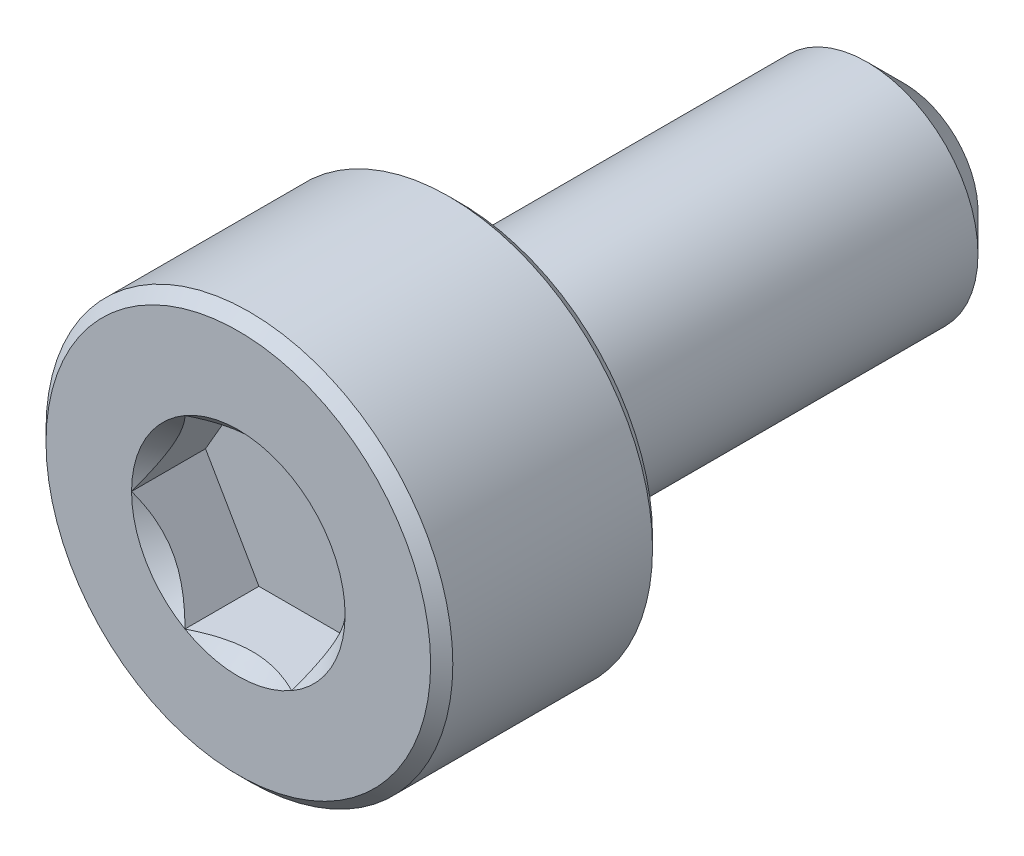
ISO-10303-21;
HEADER;
FILE_DESCRIPTION(('STEP AP214'),'2;1');
FILE_NAME('part.step','',(''),(''),'','','');
FILE_SCHEMA(('AUTOMOTIVE_DESIGN { 1 0 10303 214 1 1 1 1 }'));
ENDSEC;
DATA;
#1=APPLICATION_CONTEXT('core data for automotive mechanical design processes');
#2=APPLICATION_PROTOCOL_DEFINITION('international standard','automotive_design',2000,#1);
#3=PRODUCT_CONTEXT('',#1,'mechanical');
#4=PRODUCT('Part','Part','',(#3));
#5=PRODUCT_RELATED_PRODUCT_CATEGORY('part','',(#4));
#6=PRODUCT_DEFINITION_FORMATION('','',#4);
#7=PRODUCT_DEFINITION_CONTEXT('part definition',#1,'design');
#8=PRODUCT_DEFINITION('design','',#6,#7);
#9=PRODUCT_DEFINITION_SHAPE('','',#8);
#10=(LENGTH_UNIT() NAMED_UNIT(*) SI_UNIT(.MILLI.,.METRE.));
#11=(NAMED_UNIT(*) PLANE_ANGLE_UNIT() SI_UNIT($,.RADIAN.));
#12=(NAMED_UNIT(*) SI_UNIT($,.STERADIAN.) SOLID_ANGLE_UNIT());
#13=UNCERTAINTY_MEASURE_WITH_UNIT(LENGTH_MEASURE(1.E-05),#10,'distance_accuracy_value','');
#14=(GEOMETRIC_REPRESENTATION_CONTEXT(3) GLOBAL_UNCERTAINTY_ASSIGNED_CONTEXT((#13)) GLOBAL_UNIT_ASSIGNED_CONTEXT((#10,
#11,#12)) REPRESENTATION_CONTEXT('',''));
#15=CARTESIAN_POINT('',(0.,0.,0.));
#16=DIRECTION('',(0.,0.,1.));
#17=DIRECTION('',(1.,0.,0.));
#18=AXIS2_PLACEMENT_3D('',#15,#16,#17);
#19=CARTESIAN_POINT('',(0.,2.6,4.5));
#20=DIRECTION('',(0.,0.,1.));
#21=DIRECTION('',(1.,0.,0.));
#22=AXIS2_PLACEMENT_3D('',#19,#20,#21);
#23=PLANE('',#22);
#24=CARTESIAN_POINT('',(0.,0.,4.5));
#25=DIRECTION('',(0.,0.,1.));
#26=DIRECTION('',(1.,0.,0.));
#27=AXIS2_PLACEMENT_3D('',#24,#25,#26);
#28=CIRCLE('',#27,1.44337567297406);
#29=CARTESIAN_POINT('',(1.44337567297406,0.,4.5));
#30=VERTEX_POINT('',#29);
#31=CARTESIAN_POINT('',(0.721687836487031,1.25,4.5));
#32=VERTEX_POINT('',#31);
#33=EDGE_CURVE('E94',#30,#32,#28,.T.);
#34=ORIENTED_EDGE('',*,*,#33,.F.);
#35=CARTESIAN_POINT('',(0.721687836487031,-1.25,4.5));
#36=VERTEX_POINT('',#35);
#37=EDGE_CURVE('E54',#36,#30,#28,.T.);
#38=ORIENTED_EDGE('',*,*,#37,.F.);
#39=CARTESIAN_POINT('',(-0.721687836487033,-1.25,4.5));
#40=VERTEX_POINT('',#39);
#41=EDGE_CURVE('E297',#40,#36,#28,.T.);
#42=ORIENTED_EDGE('',*,*,#41,.F.);
#43=CARTESIAN_POINT('',(-1.44337567297406,0.,4.5));
#44=VERTEX_POINT('',#43);
#45=EDGE_CURVE('E61',#44,#40,#28,.T.);
#46=ORIENTED_EDGE('',*,*,#45,.F.);
#47=CARTESIAN_POINT('',(-0.721687836487031,1.25,4.5));
#48=VERTEX_POINT('',#47);
#49=EDGE_CURVE('E129',#48,#44,#28,.T.);
#50=ORIENTED_EDGE('',*,*,#49,.F.);
#51=EDGE_CURVE('E103',#32,#48,#28,.T.);
#52=ORIENTED_EDGE('',*,*,#51,.F.);
#53=EDGE_LOOP('',(#34,#38,#42,#46,#50,#52));
#54=FACE_BOUND('',#53,.T.);
#55=CARTESIAN_POINT('',(0.,0.,4.5));
#56=DIRECTION('',(0.,0.,-1.));
#57=DIRECTION('',(-1.,0.,0.));
#58=AXIS2_PLACEMENT_3D('',#55,#56,#57);
#59=CIRCLE('',#58,2.6);
#60=CARTESIAN_POINT('',(-2.6,0.,4.5));
#61=VERTEX_POINT('',#60);
#62=EDGE_CURVE('E48',#61,#61,#59,.T.);
#63=ORIENTED_EDGE('',*,*,#62,.F.);
#64=EDGE_LOOP('',(#63));
#65=FACE_BOUND('',#64,.T.);
#66=ADVANCED_FACE('F35',(#54,#65),#23,.T.);
#67=CARTESIAN_POINT('',(0.,0.,4.35));
#68=DIRECTION('',(0.,0.,-1.));
#69=DIRECTION('',(-1.,0.,0.));
#70=AXIS2_PLACEMENT_3D('',#67,#68,#69);
#71=CONICAL_SURFACE('',#70,2.75,0.785398163397447);
#72=ORIENTED_EDGE('',*,*,#62,.T.);
#73=EDGE_LOOP('',(#72));
#74=FACE_BOUND('',#73,.T.);
#75=CARTESIAN_POINT('',(0.,0.,4.35));
#76=DIRECTION('',(0.,0.,-1.));
#77=DIRECTION('',(-1.,0.,0.));
#78=AXIS2_PLACEMENT_3D('',#75,#76,#77);
#79=CIRCLE('',#78,2.75);
#80=CARTESIAN_POINT('',(-2.75,0.,4.35));
#81=VERTEX_POINT('',#80);
#82=EDGE_CURVE('E272',#81,#81,#79,.T.);
#83=ORIENTED_EDGE('',*,*,#82,.F.);
#84=EDGE_LOOP('',(#83));
#85=FACE_BOUND('',#84,.T.);
#86=ADVANCED_FACE('F193',(#74,#85),#71,.T.);
#87=CARTESIAN_POINT('',(0.,0.,-4.5));
#88=DIRECTION('',(0.,0.,-1.));
#89=DIRECTION('',(-1.,0.,0.));
#90=AXIS2_PLACEMENT_3D('',#87,#88,#89);
#91=CYLINDRICAL_SURFACE('',#90,2.75);
#92=ORIENTED_EDGE('',*,*,#82,.T.);
#93=EDGE_LOOP('',(#92));
#94=FACE_BOUND('',#93,.T.);
#95=CARTESIAN_POINT('',(0.,0.,1.65));
#96=DIRECTION('',(0.,0.,-1.));
#97=DIRECTION('',(-1.,0.,0.));
#98=AXIS2_PLACEMENT_3D('',#95,#96,#97);
#99=CIRCLE('',#98,2.75);
#100=CARTESIAN_POINT('',(-2.75,0.,1.65));
#101=VERTEX_POINT('',#100);
#102=EDGE_CURVE('E269',#101,#101,#99,.T.);
#103=ORIENTED_EDGE('',*,*,#102,.F.);
#104=EDGE_LOOP('',(#103));
#105=FACE_BOUND('',#104,.T.);
#106=ADVANCED_FACE('F197',(#94,#105),#91,.T.);
#107=CARTESIAN_POINT('',(0.,0.,1.5));
#108=DIRECTION('',(0.,0.,1.));
#109=DIRECTION('',(1.,0.,0.));
#110=AXIS2_PLACEMENT_3D('',#107,#108,#109);
#111=CONICAL_SURFACE('',#110,2.6,0.785398163397447);
#112=ORIENTED_EDGE('',*,*,#102,.T.);
#113=EDGE_LOOP('',(#112));
#114=FACE_BOUND('',#113,.T.);
#115=CARTESIAN_POINT('',(0.,0.,1.5));
#116=DIRECTION('',(0.,0.,-1.));
#117=DIRECTION('',(-1.,0.,0.));
#118=AXIS2_PLACEMENT_3D('',#115,#116,#117);
#119=CIRCLE('',#118,2.6);
#120=CARTESIAN_POINT('',(-2.6,0.,1.5));
#121=VERTEX_POINT('',#120);
#122=EDGE_CURVE('E266',#121,#121,#119,.T.);
#123=ORIENTED_EDGE('',*,*,#122,.F.);
#124=EDGE_LOOP('',(#123));
#125=FACE_BOUND('',#124,.T.);
#126=ADVANCED_FACE('F202',(#114,#125),#111,.T.);
#127=CARTESIAN_POINT('',(0.,2.6,1.5));
#128=DIRECTION('',(0.,0.,-1.));
#129=DIRECTION('',(-1.,0.,0.));
#130=AXIS2_PLACEMENT_3D('',#127,#128,#129);
#131=PLANE('',#130);
#132=ORIENTED_EDGE('',*,*,#122,.T.);
#133=EDGE_LOOP('',(#132));
#134=FACE_BOUND('',#133,.T.);
#135=CARTESIAN_POINT('',(0.,0.,1.5));
#136=DIRECTION('',(0.,0.,-1.));
#137=DIRECTION('',(-1.,0.,0.));
#138=AXIS2_PLACEMENT_3D('',#135,#136,#137);
#139=CIRCLE('',#138,1.5);
#140=CARTESIAN_POINT('',(-1.5,0.,1.5));
#141=VERTEX_POINT('',#140);
#142=EDGE_CURVE('E263',#141,#141,#139,.T.);
#143=ORIENTED_EDGE('',*,*,#142,.F.);
#144=EDGE_LOOP('',(#143));
#145=FACE_BOUND('',#144,.T.);
#146=ADVANCED_FACE('F210',(#134,#145),#131,.T.);
#147=CARTESIAN_POINT('',(0.,0.,-4.5));
#148=DIRECTION('',(0.,0.,-1.));
#149=DIRECTION('',(-1.,0.,0.));
#150=AXIS2_PLACEMENT_3D('',#147,#148,#149);
#151=CYLINDRICAL_SURFACE('',#150,1.5);
#152=ORIENTED_EDGE('',*,*,#142,.T.);
#153=EDGE_LOOP('',(#152));
#154=FACE_BOUND('',#153,.T.);
#155=CARTESIAN_POINT('',(0.,0.,-3.99999999999999));
#156=DIRECTION('',(0.,0.,-1.));
#157=DIRECTION('',(-1.,0.,0.));
#158=AXIS2_PLACEMENT_3D('',#155,#156,#157);
#159=CIRCLE('',#158,1.5);
#160=CARTESIAN_POINT('',(-1.5,0.,-3.99999999999999));
#161=VERTEX_POINT('',#160);
#162=EDGE_CURVE('E260',#161,#161,#159,.T.);
#163=ORIENTED_EDGE('',*,*,#162,.F.);
#164=EDGE_LOOP('',(#163));
#165=FACE_BOUND('',#164,.T.);
#166=ADVANCED_FACE('F214',(#154,#165),#151,.T.);
#167=CARTESIAN_POINT('',(0.,0.,-4.5));
#168=DIRECTION('',(0.,0.,1.));
#169=DIRECTION('',(1.,0.,0.));
#170=AXIS2_PLACEMENT_3D('',#167,#168,#169);
#171=CONICAL_SURFACE('',#170,1.,0.785398163397442);
#172=ORIENTED_EDGE('',*,*,#162,.T.);
#173=EDGE_LOOP('',(#172));
#174=FACE_BOUND('',#173,.T.);
#175=CARTESIAN_POINT('',(0.,0.,-4.5));
#176=DIRECTION('',(0.,0.,-1.));
#177=DIRECTION('',(-1.,0.,0.));
#178=AXIS2_PLACEMENT_3D('',#175,#176,#177);
#179=CIRCLE('',#178,1.);
#180=CARTESIAN_POINT('',(-1.,0.,-4.5));
#181=VERTEX_POINT('',#180);
#182=EDGE_CURVE('E242',#181,#181,#179,.T.);
#183=ORIENTED_EDGE('',*,*,#182,.F.);
#184=EDGE_LOOP('',(#183));
#185=FACE_BOUND('',#184,.T.);
#186=ADVANCED_FACE('F218',(#174,#185),#171,.T.);
#187=CARTESIAN_POINT('',(0.,1.,-4.5));
#188=DIRECTION('',(0.,0.,-1.));
#189=DIRECTION('',(-1.,0.,0.));
#190=AXIS2_PLACEMENT_3D('',#187,#188,#189);
#191=PLANE('',#190);
#192=ORIENTED_EDGE('',*,*,#182,.T.);
#193=EDGE_LOOP('',(#192));
#194=FACE_BOUND('',#193,.T.);
#195=ADVANCED_FACE('F222',(#194),#191,.T.);
#196=CARTESIAN_POINT('',(0.,0.,4.5));
#197=DIRECTION('',(0.,0.,1.));
#198=DIRECTION('',(1.,0.,0.));
#199=AXIS2_PLACEMENT_3D('',#196,#197,#198);
#200=CONICAL_SURFACE('',#199,1.44337567297406,0.78539816339745);
#201=ORIENTED_EDGE('',*,*,#51,.T.);
#202=CARTESIAN_POINT('',(-1.38510181874982,1.25,4.92237003539674));
#203=CARTESIAN_POINT('',(-1.3511198664462,1.25,4.89714624516244));
#204=CARTESIAN_POINT('',(-1.31694282655271,1.25,4.87218595606241));
#205=CARTESIAN_POINT('',(-1.24812142569207,1.25,4.82289946364711));
#206=CARTESIAN_POINT('',(-1.21347694388891,1.25,4.7985734292472));
#207=CARTESIAN_POINT('',(-1.10822083190006,1.25,4.72636172296323));
#208=CARTESIAN_POINT('',(-1.0368031370095,1.25,4.67963105585342));
#209=CARTESIAN_POINT('',(-0.887382773604422,1.25,4.58837288370571));
#210=CARTESIAN_POINT('',(-0.809230859559387,1.25,4.54408680019188));
#211=CARTESIAN_POINT('',(-0.649095969048193,1.25,4.46341771967474));
#212=CARTESIAN_POINT('',(-0.567127025311257,1.25,4.42700818355541));
#213=CARTESIAN_POINT('',(-0.443557329124525,1.25,4.38248253752399));
#214=CARTESIAN_POINT('',(-0.403672751095206,1.25,4.36961750878661));
#215=CARTESIAN_POINT('',(-0.322988211495524,1.25,4.34709732587494));
#216=CARTESIAN_POINT('',(-0.282188182544569,1.25,4.3374424088096));
#217=CARTESIAN_POINT('',(-0.200572984829334,1.25,4.32199119628927));
#218=CARTESIAN_POINT('',(-0.159769911270981,1.25,4.31613197729548));
#219=CARTESIAN_POINT('',(-0.0777868297167925,1.25,4.30837795442431));
#220=CARTESIAN_POINT('',(-0.0366068776776866,1.25,4.30648257131138));
#221=CARTESIAN_POINT('',(0.0444683003388069,1.25,4.30677812948321));
#222=CARTESIAN_POINT('',(0.0843640386448805,1.25,4.3088450344818));
#223=CARTESIAN_POINT('',(0.16379054813703,1.25,4.3166895703397));
#224=CARTESIAN_POINT('',(0.203321244417683,1.25,4.32246794634046));
#225=CARTESIAN_POINT('',(0.282393987539772,1.25,4.33752741705993));
#226=CARTESIAN_POINT('',(0.321924895820598,1.25,4.34686615718743));
#227=CARTESIAN_POINT('',(0.400129026379049,1.25,4.36856655366507));
#228=CARTESIAN_POINT('',(0.438802337754634,1.25,4.38092789436938));
#229=CARTESIAN_POINT('',(0.563172797994067,1.25,4.42526147510657));
#230=CARTESIAN_POINT('',(0.647028634884196,1.25,4.46238856151275));
#231=CARTESIAN_POINT('',(0.810774513742064,1.25,4.54485212171168));
#232=CARTESIAN_POINT('',(0.890648634134941,1.25,4.59021863514241));
#233=CARTESIAN_POINT('',(1.04325497380786,1.25,4.68372168049333));
#234=CARTESIAN_POINT('',(1.11614441754118,1.25,4.73160472363706));
#235=CARTESIAN_POINT('',(1.22353403061444,1.25,4.8055883961688));
#236=CARTESIAN_POINT('',(1.25886568278664,1.25,4.83050307518733));
#237=CARTESIAN_POINT('',(1.32904842602817,1.25,4.88098117870981));
#238=CARTESIAN_POINT('',(1.36389964521094,1.25,4.90654442489043));
#239=CARTESIAN_POINT('',(1.39855118522491,1.25,4.93237628762573));
#240=B_SPLINE_CURVE_WITH_KNOTS('',3,(#202,#203,#204,#205,#206,#207,#208,#209,#210,#211,#212,
#213,#214,#215,#216,#217,#218,#219,#220,#221,#222,#223,#224,#225,#226,#227,#228,#229,#230,#231,
#232,#233,#234,#235,#236,#237,#238,#239),.UNSPECIFIED.,.F.,.F.,(4,2,2,2,2,2,2,2,2,2,2,2,2,2,2,2,
2,2,4),(0.,0.126957685716233,0.253948844536467,0.509869207561396,0.779115442456376,
1.04743984385779,1.17305649104353,1.29868241461005,1.42216852508156,1.54563658925964,
1.66530259813563,1.78499263952808,1.90670905530249,2.0284127658315,2.30272027123448,
2.57804870180744,2.83955157020837,2.96924487037104,3.0989028897939),.UNSPECIFIED.);
#241=EDGE_CURVE('E12',#32,#48,#240,.F.);
#242=ORIENTED_EDGE('',*,*,#241,.F.);
#243=EDGE_LOOP('',(#201,#242));
#244=FACE_BOUND('',#243,.T.);
#245=ADVANCED_FACE('F107',(#244),#200,.F.);
#246=ORIENTED_EDGE('',*,*,#49,.T.);
#247=CARTESIAN_POINT('',(-0.721572366433194,1.2502,4.50011548390914));
#248=CARTESIAN_POINT('',(-0.746384090710444,1.20722483292841,4.47532166805511));
#249=CARTESIAN_POINT('',(-0.771610739653664,1.16353099525405,4.45198373441869));
#250=CARTESIAN_POINT('',(-0.823050873919154,1.07443406915806,4.40925200408454));
#251=CARTESIAN_POINT('',(-0.849269254648333,1.02902250164294,4.38988199236042));
#252=CARTESIAN_POINT('',(-0.902137405038635,0.937452179064741,4.35670048341348));
#253=CARTESIAN_POINT('',(-0.928773701756387,0.891316759824116,4.34280555905266));
#254=CARTESIAN_POINT('',(-0.982632884076012,0.798029919592409,4.32139728216064));
#255=CARTESIAN_POINT('',(-1.00985412292348,0.750881350863622,4.31386794156679));
#256=CARTESIAN_POINT('',(-1.05676666578643,0.66962644311275,4.3070744980507));
#257=CARTESIAN_POINT('',(-1.07639733689152,0.635625123372061,4.30606855910435));
#258=CARTESIAN_POINT('',(-1.11562418145499,0.567682235567525,4.30776141491132));
#259=CARTESIAN_POINT('',(-1.1352203463451,0.533740682344345,4.31046102721554));
#260=CARTESIAN_POINT('',(-1.1742235548576,0.466185143542503,4.31940893031638));
#261=CARTESIAN_POINT('',(-1.19363040521232,0.432571492713227,4.32566052589971));
#262=CARTESIAN_POINT('',(-1.23212011385119,0.365905361782189,4.3413756814139));
#263=CARTESIAN_POINT('',(-1.2512028293628,0.332853128969707,4.35084062008746));
#264=CARTESIAN_POINT('',(-1.30007715810653,0.248200308399738,4.37893139068759));
#265=CARTESIAN_POINT('',(-1.32956058931202,0.197133507570364,4.3996701574522));
#266=CARTESIAN_POINT('',(-1.38737318998519,0.0969991458867465,4.44638713467148));
#267=CARTESIAN_POINT('',(-1.41570576386268,0.0479256884217316,4.47234829594677));
#268=CARTESIAN_POINT('',(-1.4434911430279,-0.000199999999999488,4.50011548390914));
#269=B_SPLINE_CURVE_WITH_KNOTS('',3,(#247,#248,#249,#250,#251,#252,#253,#254,#255,#256,#257,
#258,#259,#260,#261,#262,#263,#264,#265,#266,#267,#268),.UNSPECIFIED.,.F.,.F.,(4,2,2,2,2,2,2,2,
2,2,4),(0.,0.166533409618303,0.334037607289761,0.498880396489697,0.663307919240272,
0.780963963458824,0.89864597014845,1.01643764860773,1.13427993171549,1.32148652032141,
1.50809158792573),.UNSPECIFIED.);
#270=EDGE_CURVE('E102',#48,#44,#269,.T.);
#271=ORIENTED_EDGE('',*,*,#270,.F.);
#272=EDGE_LOOP('',(#246,#271));
#273=FACE_BOUND('',#272,.T.);
#274=ADVANCED_FACE('F305',(#273),#200,.F.);
#275=ORIENTED_EDGE('',*,*,#45,.T.);
#276=CARTESIAN_POINT('',(-1.4434911430279,0.000200000000000513,4.50011548390914));
#277=CARTESIAN_POINT('',(-1.41867941875065,-0.0427751670715862,4.47532166805511));
#278=CARTESIAN_POINT('',(-1.39345276980743,-0.0864690047459475,4.45198373441869));
#279=CARTESIAN_POINT('',(-1.34201263554194,-0.175565930841941,4.40925200408454));
#280=CARTESIAN_POINT('',(-1.31579425481276,-0.220977498357064,4.38988199236042));
#281=CARTESIAN_POINT('',(-1.26292610442246,-0.312547820935259,4.35670048341348));
#282=CARTESIAN_POINT('',(-1.23628980770471,-0.358683240175885,4.34280555905266));
#283=CARTESIAN_POINT('',(-1.18243062538508,-0.451970080407592,4.32139728216064));
#284=CARTESIAN_POINT('',(-1.15520938653761,-0.499118649136379,4.31386794156679));
#285=CARTESIAN_POINT('',(-1.10829684367467,-0.580373556887252,4.3070744980507));
#286=CARTESIAN_POINT('',(-1.08866617256958,-0.614374876627941,4.30606855910435));
#287=CARTESIAN_POINT('',(-1.04943932800611,-0.682317764432477,4.30776141491132));
#288=CARTESIAN_POINT('',(-1.02984316311599,-0.716259317655657,4.31046102721554));
#289=CARTESIAN_POINT('',(-0.990839954603499,-0.783814856457499,4.31940893031638));
#290=CARTESIAN_POINT('',(-0.971433104248771,-0.817428507286775,4.32566052589971));
#291=CARTESIAN_POINT('',(-0.932943395609905,-0.884094638217813,4.34137568141391));
#292=CARTESIAN_POINT('',(-0.913860680098301,-0.917146871030295,4.35084062008746));
#293=CARTESIAN_POINT('',(-0.864986351354568,-1.00179969160026,4.37893139068759));
#294=CARTESIAN_POINT('',(-0.835502920149076,-1.05286649242964,4.3996701574522));
#295=CARTESIAN_POINT('',(-0.777690319475909,-1.15300085411325,4.44638713467148));
#296=CARTESIAN_POINT('',(-0.749357745598417,-1.20207431157827,4.47234829594677));
#297=CARTESIAN_POINT('',(-0.721572366433195,-1.2502,4.50011548390914));
#298=B_SPLINE_CURVE_WITH_KNOTS('',3,(#276,#277,#278,#279,#280,#281,#282,#283,#284,#285,#286,
#287,#288,#289,#290,#291,#292,#293,#294,#295,#296,#297),.UNSPECIFIED.,.F.,.F.,(4,2,2,2,2,2,2,2,
2,2,4),(0.,0.166533409618304,0.334037607289762,0.498880396489698,0.663307919240275,
0.780963963458827,0.898645970148453,1.01643764860773,1.1342799317155,1.32148652032141,
1.50809158792573),.UNSPECIFIED.);
#299=EDGE_CURVE('E138',#44,#40,#298,.T.);
#300=ORIENTED_EDGE('',*,*,#299,.F.);
#301=EDGE_LOOP('',(#275,#300));
#302=FACE_BOUND('',#301,.T.);
#303=ADVANCED_FACE('F300',(#302),#200,.F.);
#304=ORIENTED_EDGE('',*,*,#41,.T.);
#305=CARTESIAN_POINT('',(-1.38510181874983,-1.25,4.92237003539674));
#306=CARTESIAN_POINT('',(-1.3511198664462,-1.25,4.89714624516244));
#307=CARTESIAN_POINT('',(-1.31694282655271,-1.25,4.87218595606241));
#308=CARTESIAN_POINT('',(-1.24812142569207,-1.25,4.82289946364711));
#309=CARTESIAN_POINT('',(-1.21347694388891,-1.25,4.7985734292472));
#310=CARTESIAN_POINT('',(-1.10822083190006,-1.25,4.72636172296323));
#311=CARTESIAN_POINT('',(-1.0368031370095,-1.25,4.67963105585342));
#312=CARTESIAN_POINT('',(-0.887382773604422,-1.25,4.58837288370571));
#313=CARTESIAN_POINT('',(-0.809230859559387,-1.25,4.54408680019188));
#314=CARTESIAN_POINT('',(-0.649095969048193,-1.25,4.46341771967474));
#315=CARTESIAN_POINT('',(-0.567127025311257,-1.25,4.42700818355541));
#316=CARTESIAN_POINT('',(-0.443557329124525,-1.25,4.38248253752399));
#317=CARTESIAN_POINT('',(-0.403672751095206,-1.25,4.36961750878661));
#318=CARTESIAN_POINT('',(-0.322988211495524,-1.25,4.34709732587493));
#319=CARTESIAN_POINT('',(-0.28218818254457,-1.25,4.3374424088096));
#320=CARTESIAN_POINT('',(-0.200572984829335,-1.25,4.32199119628927));
#321=CARTESIAN_POINT('',(-0.159769911270982,-1.25,4.31613197729548));
#322=CARTESIAN_POINT('',(-0.077786829716793,-1.25,4.30837795442431));
#323=CARTESIAN_POINT('',(-0.0366068776776872,-1.25,4.30648257131138));
#324=CARTESIAN_POINT('',(0.0444683003388065,-1.25,4.30677812948321));
#325=CARTESIAN_POINT('',(0.0843640386448801,-1.25,4.3088450344818));
#326=CARTESIAN_POINT('',(0.16379054813703,-1.25,4.31668957033969));
#327=CARTESIAN_POINT('',(0.203321244417683,-1.25,4.32246794634046));
#328=CARTESIAN_POINT('',(0.282393987539771,-1.25,4.33752741705993));
#329=CARTESIAN_POINT('',(0.321924895820597,-1.25,4.34686615718743));
#330=CARTESIAN_POINT('',(0.400129026379048,-1.25,4.36856655366507));
#331=CARTESIAN_POINT('',(0.438802337754633,-1.25,4.38092789436938));
#332=CARTESIAN_POINT('',(0.563172797994066,-1.25,4.42526147510656));
#333=CARTESIAN_POINT('',(0.647028634884195,-1.25,4.46238856151275));
#334=CARTESIAN_POINT('',(0.810774513742062,-1.25,4.54485212171168));
#335=CARTESIAN_POINT('',(0.890648634134939,-1.25,4.5902186351424));
#336=CARTESIAN_POINT('',(1.04325497380785,-1.25,4.68372168049333));
#337=CARTESIAN_POINT('',(1.11614441754118,-1.25,4.73160472363706));
#338=CARTESIAN_POINT('',(1.22353403061444,-1.25,4.8055883961688));
#339=CARTESIAN_POINT('',(1.25886568278664,-1.25,4.83050307518733));
#340=CARTESIAN_POINT('',(1.32904842602817,-1.25,4.8809811787098));
#341=CARTESIAN_POINT('',(1.36389964521094,-1.25,4.90654442489043));
#342=CARTESIAN_POINT('',(1.3985511852249,-1.25,4.93237628762573));
#343=B_SPLINE_CURVE_WITH_KNOTS('',3,(#305,#306,#307,#308,#309,#310,#311,#312,#313,#314,#315,
#316,#317,#318,#319,#320,#321,#322,#323,#324,#325,#326,#327,#328,#329,#330,#331,#332,#333,#334,
#335,#336,#337,#338,#339,#340,#341,#342),.UNSPECIFIED.,.F.,.F.,(4,2,2,2,2,2,2,2,2,2,2,2,2,2,2,2,
2,2,4),(0.,0.126957685716233,0.253948844536467,0.509869207561397,0.779115442456378,
1.04743984385779,1.17305649104353,1.29868241461005,1.42216852508156,1.54563658925964,
1.66530259813563,1.78499263952808,1.90670905530249,2.0284127658315,2.30272027123448,
2.57804870180744,2.83955157020837,2.96924487037104,3.0989028897939),.UNSPECIFIED.);
#344=EDGE_CURVE('E158',#40,#36,#343,.T.);
#345=ORIENTED_EDGE('',*,*,#344,.F.);
#346=EDGE_LOOP('',(#304,#345));
#347=FACE_BOUND('',#346,.T.);
#348=ADVANCED_FACE('F298',(#347),#200,.F.);
#349=ORIENTED_EDGE('',*,*,#37,.T.);
#350=CARTESIAN_POINT('',(0.721572366433193,-1.2502,4.50011548390914));
#351=CARTESIAN_POINT('',(0.746384090710443,-1.20722483292841,4.4753216680551));
#352=CARTESIAN_POINT('',(0.771610739653663,-1.16353099525405,4.45198373441868));
#353=CARTESIAN_POINT('',(0.823050873919153,-1.07443406915806,4.40925200408454));
#354=CARTESIAN_POINT('',(0.849269254648332,-1.02902250164294,4.38988199236041));
#355=CARTESIAN_POINT('',(0.902137405038634,-0.93745217906474,4.35670048341348));
#356=CARTESIAN_POINT('',(0.928773701756385,-0.891316759824115,4.34280555905266));
#357=CARTESIAN_POINT('',(0.982632884076011,-0.798029919592408,4.32139728216064));
#358=CARTESIAN_POINT('',(1.00985412292348,-0.750881350863621,4.31386794156679));
#359=CARTESIAN_POINT('',(1.05676666578643,-0.669626443112749,4.3070744980507));
#360=CARTESIAN_POINT('',(1.07639733689152,-0.63562512337206,4.30606855910435));
#361=CARTESIAN_POINT('',(1.11562418145498,-0.567682235567524,4.30776141491132));
#362=CARTESIAN_POINT('',(1.1352203463451,-0.533740682344344,4.31046102721554));
#363=CARTESIAN_POINT('',(1.1742235548576,-0.466185143542502,4.31940893031638));
#364=CARTESIAN_POINT('',(1.19363040521232,-0.432571492713226,4.32566052589971));
#365=CARTESIAN_POINT('',(1.23212011385119,-0.365905361782188,4.3413756814139));
#366=CARTESIAN_POINT('',(1.25120282936279,-0.332853128969706,4.35084062008746));
#367=CARTESIAN_POINT('',(1.30007715810653,-0.248200308399737,4.37893139068759));
#368=CARTESIAN_POINT('',(1.32956058931202,-0.197133507570362,4.3996701574522));
#369=CARTESIAN_POINT('',(1.38737318998519,-0.096999145886745,4.44638713467148));
#370=CARTESIAN_POINT('',(1.41570576386268,-0.0479256884217301,4.47234829594677));
#371=CARTESIAN_POINT('',(1.4434911430279,0.00020000000000041,4.50011548390914));
#372=B_SPLINE_CURVE_WITH_KNOTS('',3,(#350,#351,#352,#353,#354,#355,#356,#357,#358,#359,#360,
#361,#362,#363,#364,#365,#366,#367,#368,#369,#370,#371),.UNSPECIFIED.,.F.,.F.,(4,2,2,2,2,2,2,2,
2,2,4),(0.,0.166533409618303,0.33403760728976,0.498880396489697,0.663307919240272,
0.780963963458824,0.89864597014845,1.01643764860773,1.13427993171549,1.32148652032141,
1.50809158792574),.UNSPECIFIED.);
#373=EDGE_CURVE('E119',#36,#30,#372,.T.);
#374=ORIENTED_EDGE('',*,*,#373,.F.);
#375=EDGE_LOOP('',(#349,#374));
#376=FACE_BOUND('',#375,.T.);
#377=ADVANCED_FACE('F151',(#376),#200,.F.);
#378=ORIENTED_EDGE('',*,*,#33,.T.);
#379=CARTESIAN_POINT('',(1.4434911430279,-0.000199999999999486,4.50011548390914));
#380=CARTESIAN_POINT('',(1.41867941875065,0.0427751670715871,4.4753216680551));
#381=CARTESIAN_POINT('',(1.39345276980743,0.0864690047459483,4.45198373441868));
#382=CARTESIAN_POINT('',(1.34201263554194,0.175565930841942,4.40925200408454));
#383=CARTESIAN_POINT('',(1.31579425481276,0.220977498357064,4.38988199236041));
#384=CARTESIAN_POINT('',(1.26292610442246,0.31254782093526,4.35670048341348));
#385=CARTESIAN_POINT('',(1.23628980770471,0.358683240175885,4.34280555905266));
#386=CARTESIAN_POINT('',(1.18243062538508,0.451970080407592,4.32139728216064));
#387=CARTESIAN_POINT('',(1.15520938653761,0.499118649136379,4.31386794156679));
#388=CARTESIAN_POINT('',(1.10829684367467,0.580373556887252,4.3070744980507));
#389=CARTESIAN_POINT('',(1.08866617256958,0.61437487662794,4.30606855910435));
#390=CARTESIAN_POINT('',(1.04943932800611,0.682317764432477,4.30776141491132));
#391=CARTESIAN_POINT('',(1.02984316311599,0.716259317655657,4.31046102721554));
#392=CARTESIAN_POINT('',(0.990839954603499,0.783814856457499,4.31940893031638));
#393=CARTESIAN_POINT('',(0.971433104248771,0.817428507286774,4.32566052589971));
#394=CARTESIAN_POINT('',(0.932943395609905,0.884094638217812,4.34137568141391));
#395=CARTESIAN_POINT('',(0.913860680098301,0.917146871030295,4.35084062008746));
#396=CARTESIAN_POINT('',(0.864986351354568,1.00179969160026,4.37893139068759));
#397=CARTESIAN_POINT('',(0.835502920149076,1.05286649242964,4.3996701574522));
#398=CARTESIAN_POINT('',(0.777690319475908,1.15300085411325,4.44638713467148));
#399=CARTESIAN_POINT('',(0.749357745598417,1.20207431157827,4.47234829594677));
#400=CARTESIAN_POINT('',(0.721572366433194,1.2502,4.50011548390914));
#401=B_SPLINE_CURVE_WITH_KNOTS('',3,(#379,#380,#381,#382,#383,#384,#385,#386,#387,#388,#389,
#390,#391,#392,#393,#394,#395,#396,#397,#398,#399,#400),.UNSPECIFIED.,.F.,.F.,(4,2,2,2,2,2,2,2,
2,2,4),(0.,0.166533409618303,0.334037607289761,0.498880396489697,0.663307919240273,
0.780963963458825,0.898645970148452,1.01643764860773,1.13427993171549,1.32148652032141,
1.50809158792573),.UNSPECIFIED.);
#402=EDGE_CURVE('E98',#30,#32,#401,.T.);
#403=ORIENTED_EDGE('',*,*,#402,.F.);
#404=EDGE_LOOP('',(#378,#403));
#405=FACE_BOUND('',#404,.T.);
#406=ADVANCED_FACE('F96',(#405),#200,.F.);
#407=CARTESIAN_POINT('',(0.,2.6,3.5));
#408=DIRECTION('',(0.,0.,1.));
#409=DIRECTION('',(1.,0.,0.));
#410=AXIS2_PLACEMENT_3D('',#407,#408,#409);
#411=PLANE('',#410);
#412=DIRECTION('',(0.5,-0.866025403784439,0.));
#413=VECTOR('',#412,1.);
#414=CARTESIAN_POINT('',(1.44337567297406,0.,3.5));
#415=LINE('',#414,#413);
#416=CARTESIAN_POINT('',(0.721687836487032,1.25,3.5));
#417=VERTEX_POINT('',#416);
#418=CARTESIAN_POINT('',(1.44337567297406,0.,3.5));
#419=VERTEX_POINT('',#418);
#420=EDGE_CURVE('E237',#417,#419,#415,.T.);
#421=ORIENTED_EDGE('',*,*,#420,.F.);
#422=DIRECTION('',(1.,0.,0.));
#423=VECTOR('',#422,1.);
#424=CARTESIAN_POINT('',(0.721687836487032,1.25,3.5));
#425=LINE('',#424,#423);
#426=CARTESIAN_POINT('',(-0.721687836487032,1.25,3.5));
#427=VERTEX_POINT('',#426);
#428=EDGE_CURVE('E123',#427,#417,#425,.T.);
#429=ORIENTED_EDGE('',*,*,#428,.F.);
#430=DIRECTION('',(0.5,0.866025403784439,0.));
#431=VECTOR('',#430,1.);
#432=CARTESIAN_POINT('',(-0.721687836487032,1.25,3.5));
#433=LINE('',#432,#431);
#434=CARTESIAN_POINT('',(-1.44337567297406,0.,3.5));
#435=VERTEX_POINT('',#434);
#436=EDGE_CURVE('E249',#435,#427,#433,.T.);
#437=ORIENTED_EDGE('',*,*,#436,.F.);
#438=DIRECTION('',(-0.5,0.866025403784439,0.));
#439=VECTOR('',#438,1.);
#440=CARTESIAN_POINT('',(-1.44337567297406,0.,3.5));
#441=LINE('',#440,#439);
#442=CARTESIAN_POINT('',(-0.721687836487033,-1.25,3.5));
#443=VERTEX_POINT('',#442);
#444=EDGE_CURVE('E288',#443,#435,#441,.T.);
#445=ORIENTED_EDGE('',*,*,#444,.F.);
#446=DIRECTION('',(-1.,0.,0.));
#447=VECTOR('',#446,1.);
#448=CARTESIAN_POINT('',(-0.721687836487033,-1.25,3.5));
#449=LINE('',#448,#447);
#450=CARTESIAN_POINT('',(0.721687836487031,-1.25,3.5));
#451=VERTEX_POINT('',#450);
#452=EDGE_CURVE('E244',#451,#443,#449,.T.);
#453=ORIENTED_EDGE('',*,*,#452,.F.);
#454=DIRECTION('',(-0.5,-0.866025403784439,0.));
#455=VECTOR('',#454,1.);
#456=CARTESIAN_POINT('',(0.721687836487031,-1.25,3.5));
#457=LINE('',#456,#455);
#458=EDGE_CURVE('E240',#419,#451,#457,.T.);
#459=ORIENTED_EDGE('',*,*,#458,.F.);
#460=EDGE_LOOP('',(#421,#429,#437,#445,#453,#459));
#461=FACE_BOUND('',#460,.T.);
#462=ADVANCED_FACE('F150',(#461),#411,.T.);
#463=CARTESIAN_POINT('',(0.721687836487032,1.25,-1.31881307912987));
#464=DIRECTION('',(0.,1.,0.));
#465=DIRECTION('',(0.,0.,1.));
#466=AXIS2_PLACEMENT_3D('',#463,#464,#465);
#467=PLANE('',#466);
#468=DIRECTION('',(0.,0.,1.));
#469=VECTOR('',#468,1.);
#470=CARTESIAN_POINT('',(0.721687836487032,1.25,-1.31881307912987));
#471=LINE('',#470,#469);
#472=EDGE_CURVE('E116',#417,#32,#471,.T.);
#473=ORIENTED_EDGE('',*,*,#472,.T.);
#474=ORIENTED_EDGE('',*,*,#241,.T.);
#475=DIRECTION('',(0.,0.,1.));
#476=VECTOR('',#475,1.);
#477=CARTESIAN_POINT('',(-0.721687836487032,1.25,-1.31881307912987));
#478=LINE('',#477,#476);
#479=EDGE_CURVE('E125',#427,#48,#478,.T.);
#480=ORIENTED_EDGE('',*,*,#479,.F.);
#481=ORIENTED_EDGE('',*,*,#428,.T.);
#482=EDGE_LOOP('',(#473,#474,#480,#481));
#483=FACE_BOUND('',#482,.T.);
#484=ADVANCED_FACE('F121',(#483),#467,.F.);
#485=CARTESIAN_POINT('',(-0.721687836487032,1.25,-1.31881307912987));
#486=DIRECTION('',(-0.866025403784438,0.5,0.));
#487=DIRECTION('',(-0.5,-0.866025403784439,0.));
#488=AXIS2_PLACEMENT_3D('',#485,#486,#487);
#489=PLANE('',#488);
#490=ORIENTED_EDGE('',*,*,#479,.T.);
#491=ORIENTED_EDGE('',*,*,#270,.T.);
#492=DIRECTION('',(0.,0.,1.));
#493=VECTOR('',#492,1.);
#494=CARTESIAN_POINT('',(-1.44337567297406,0.,-1.31881307912987));
#495=LINE('',#494,#493);
#496=EDGE_CURVE('E255',#435,#44,#495,.T.);
#497=ORIENTED_EDGE('',*,*,#496,.F.);
#498=ORIENTED_EDGE('',*,*,#436,.T.);
#499=EDGE_LOOP('',(#490,#491,#497,#498));
#500=FACE_BOUND('',#499,.T.);
#501=ADVANCED_FACE('F145',(#500),#489,.F.);
#502=CARTESIAN_POINT('',(-1.44337567297406,0.,-1.31881307912987));
#503=DIRECTION('',(-0.866025403784438,-0.5,0.));
#504=DIRECTION('',(0.5,-0.866025403784439,0.));
#505=AXIS2_PLACEMENT_3D('',#502,#503,#504);
#506=PLANE('',#505);
#507=ORIENTED_EDGE('',*,*,#496,.T.);
#508=ORIENTED_EDGE('',*,*,#299,.T.);
#509=DIRECTION('',(0.,0.,1.));
#510=VECTOR('',#509,1.);
#511=CARTESIAN_POINT('',(-0.721687836487033,-1.25,-1.31881307912987));
#512=LINE('',#511,#510);
#513=EDGE_CURVE('E252',#443,#40,#512,.T.);
#514=ORIENTED_EDGE('',*,*,#513,.F.);
#515=ORIENTED_EDGE('',*,*,#444,.T.);
#516=EDGE_LOOP('',(#507,#508,#514,#515));
#517=FACE_BOUND('',#516,.T.);
#518=ADVANCED_FACE('F182',(#517),#506,.F.);
#519=CARTESIAN_POINT('',(-0.721687836487033,-1.25,-1.31881307912987));
#520=DIRECTION('',(0.,-1.,0.));
#521=DIRECTION('',(1.,0.,0.));
#522=AXIS2_PLACEMENT_3D('',#519,#520,#521);
#523=PLANE('',#522);
#524=ORIENTED_EDGE('',*,*,#513,.T.);
#525=ORIENTED_EDGE('',*,*,#344,.T.);
#526=DIRECTION('',(0.,0.,1.));
#527=VECTOR('',#526,1.);
#528=CARTESIAN_POINT('',(0.721687836487031,-1.25,-1.31881307912987));
#529=LINE('',#528,#527);
#530=EDGE_CURVE('E250',#451,#36,#529,.T.);
#531=ORIENTED_EDGE('',*,*,#530,.F.);
#532=ORIENTED_EDGE('',*,*,#452,.T.);
#533=EDGE_LOOP('',(#524,#525,#531,#532));
#534=FACE_BOUND('',#533,.T.);
#535=ADVANCED_FACE('F178',(#534),#523,.F.);
#536=CARTESIAN_POINT('',(0.721687836487031,-1.25,-1.31881307912987));
#537=DIRECTION('',(0.866025403784438,-0.5,0.));
#538=DIRECTION('',(0.5,0.866025403784439,0.));
#539=AXIS2_PLACEMENT_3D('',#536,#537,#538);
#540=PLANE('',#539);
#541=ORIENTED_EDGE('',*,*,#530,.T.);
#542=ORIENTED_EDGE('',*,*,#373,.T.);
#543=DIRECTION('',(0.,0.,1.));
#544=VECTOR('',#543,1.);
#545=CARTESIAN_POINT('',(1.44337567297406,0.,-1.31881307912987));
#546=LINE('',#545,#544);
#547=EDGE_CURVE('E118',#419,#30,#546,.T.);
#548=ORIENTED_EDGE('',*,*,#547,.F.);
#549=ORIENTED_EDGE('',*,*,#458,.T.);
#550=EDGE_LOOP('',(#541,#542,#548,#549));
#551=FACE_BOUND('',#550,.T.);
#552=ADVANCED_FACE('F175',(#551),#540,.F.);
#553=CARTESIAN_POINT('',(1.44337567297406,0.,-1.31881307912987));
#554=DIRECTION('',(0.866025403784439,0.5,0.));
#555=DIRECTION('',(-0.5,0.866025403784439,0.));
#556=AXIS2_PLACEMENT_3D('',#553,#554,#555);
#557=PLANE('',#556);
#558=ORIENTED_EDGE('',*,*,#547,.T.);
#559=ORIENTED_EDGE('',*,*,#402,.T.);
#560=ORIENTED_EDGE('',*,*,#472,.F.);
#561=ORIENTED_EDGE('',*,*,#420,.T.);
#562=EDGE_LOOP('',(#558,#559,#560,#561));
#563=FACE_BOUND('',#562,.T.);
#564=ADVANCED_FACE('F115',(#563),#557,.F.);
#565=CLOSED_SHELL('',(#66,#86,#106,#126,#146,#166,#186,#195,#245,#274,#303,#348,#377,#406,#462,
#484,#501,#518,#535,#552,#564));
#566=MANIFOLD_SOLID_BREP('B2',#565);
#567=ADVANCED_BREP_SHAPE_REPRESENTATION('',(#18,#566),#14);
#568=SHAPE_DEFINITION_REPRESENTATION(#9,#567);
ENDSEC;
END-ISO-10303-21;
